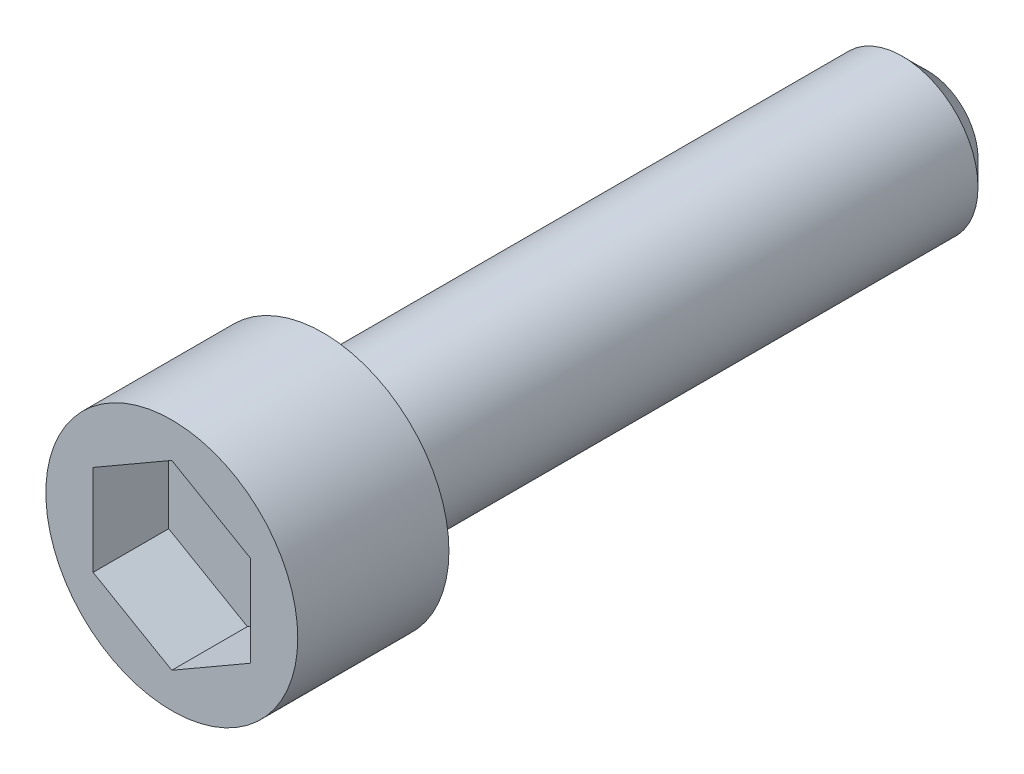
ISO-10303-21;
HEADER;
FILE_DESCRIPTION(('STEP AP214'),'2;1');
FILE_NAME('part.step','',(''),(''),'','','');
FILE_SCHEMA(('AUTOMOTIVE_DESIGN { 1 0 10303 214 1 1 1 1 }'));
ENDSEC;
DATA;
#1=APPLICATION_CONTEXT('core data for automotive mechanical design processes');
#2=APPLICATION_PROTOCOL_DEFINITION('international standard','automotive_design',2000,#1);
#3=PRODUCT_CONTEXT('',#1,'mechanical');
#4=PRODUCT('Part','Part','',(#3));
#5=PRODUCT_RELATED_PRODUCT_CATEGORY('part','',(#4));
#6=PRODUCT_DEFINITION_FORMATION('','',#4);
#7=PRODUCT_DEFINITION_CONTEXT('part definition',#1,'design');
#8=PRODUCT_DEFINITION('design','',#6,#7);
#9=PRODUCT_DEFINITION_SHAPE('','',#8);
#10=(LENGTH_UNIT() NAMED_UNIT(*) SI_UNIT(.MILLI.,.METRE.));
#11=(NAMED_UNIT(*) PLANE_ANGLE_UNIT() SI_UNIT($,.RADIAN.));
#12=(NAMED_UNIT(*) SI_UNIT($,.STERADIAN.) SOLID_ANGLE_UNIT());
#13=UNCERTAINTY_MEASURE_WITH_UNIT(LENGTH_MEASURE(1.E-05),#10,'distance_accuracy_value','');
#14=(GEOMETRIC_REPRESENTATION_CONTEXT(3) GLOBAL_UNCERTAINTY_ASSIGNED_CONTEXT((#13)) GLOBAL_UNIT_ASSIGNED_CONTEXT((#10,
#11,#12)) REPRESENTATION_CONTEXT('',''));
#15=CARTESIAN_POINT('',(0.,0.,0.));
#16=DIRECTION('',(0.,0.,1.));
#17=DIRECTION('',(1.,0.,0.));
#18=AXIS2_PLACEMENT_3D('',#15,#16,#17);
#19=CARTESIAN_POINT('',(0.,0.,12.));
#20=DIRECTION('',(0.,0.,-1.));
#21=DIRECTION('',(-1.,0.,0.));
#22=AXIS2_PLACEMENT_3D('',#19,#20,#21);
#23=CYLINDRICAL_SURFACE('',#22,1.5);
#24=CARTESIAN_POINT('',(0.,0.,0.499999999999999));
#25=DIRECTION('',(0.,0.,1.));
#26=DIRECTION('',(1.,0.,0.));
#27=AXIS2_PLACEMENT_3D('',#24,#25,#26);
#28=CIRCLE('',#27,1.5);
#29=CARTESIAN_POINT('',(1.5,0.,0.499999999999999));
#30=VERTEX_POINT('',#29);
#31=EDGE_CURVE('E44',#30,#30,#28,.T.);
#32=ORIENTED_EDGE('',*,*,#31,.T.);
#33=EDGE_LOOP('',(#32));
#34=FACE_BOUND('',#33,.T.);
#35=CARTESIAN_POINT('',(0.,0.,12.));
#36=DIRECTION('',(0.,0.,1.));
#37=DIRECTION('',(1.,0.,0.));
#38=AXIS2_PLACEMENT_3D('',#35,#36,#37);
#39=CIRCLE('',#38,1.5);
#40=CARTESIAN_POINT('',(1.5,0.,12.));
#41=VERTEX_POINT('',#40);
#42=EDGE_CURVE('E147',#41,#41,#39,.T.);
#43=ORIENTED_EDGE('',*,*,#42,.F.);
#44=EDGE_LOOP('',(#43));
#45=FACE_BOUND('',#44,.T.);
#46=ADVANCED_FACE('F36',(#34,#45),#23,.T.);
#47=CARTESIAN_POINT('',(0.,0.,0.));
#48=DIRECTION('',(0.,0.,1.));
#49=DIRECTION('',(1.,0.,0.));
#50=AXIS2_PLACEMENT_3D('',#47,#48,#49);
#51=PLANE('',#50);
#52=CARTESIAN_POINT('',(0.,0.,0.));
#53=DIRECTION('',(0.,0.,1.));
#54=DIRECTION('',(1.,0.,0.));
#55=AXIS2_PLACEMENT_3D('',#52,#53,#54);
#56=CIRCLE('',#55,0.999999999999999);
#57=CARTESIAN_POINT('',(0.999999999999999,0.,0.));
#58=VERTEX_POINT('',#57);
#59=EDGE_CURVE('E11',#58,#58,#56,.F.);
#60=ORIENTED_EDGE('',*,*,#59,.T.);
#61=EDGE_LOOP('',(#60));
#62=FACE_BOUND('',#61,.T.);
#63=ADVANCED_FACE('F165',(#62),#51,.F.);
#64=CARTESIAN_POINT('',(0.,0.,15.));
#65=DIRECTION('',(0.,0.,-1.));
#66=DIRECTION('',(-1.,0.,0.));
#67=AXIS2_PLACEMENT_3D('',#64,#65,#66);
#68=CYLINDRICAL_SURFACE('',#67,2.5);
#69=CARTESIAN_POINT('',(0.,0.,15.));
#70=DIRECTION('',(0.,0.,1.));
#71=DIRECTION('',(1.,0.,0.));
#72=AXIS2_PLACEMENT_3D('',#69,#70,#71);
#73=CIRCLE('',#72,2.5);
#74=CARTESIAN_POINT('',(2.5,0.,15.));
#75=VERTEX_POINT('',#74);
#76=EDGE_CURVE('E144',#75,#75,#73,.T.);
#77=ORIENTED_EDGE('',*,*,#76,.F.);
#78=EDGE_LOOP('',(#77));
#79=FACE_BOUND('',#78,.T.);
#80=CARTESIAN_POINT('',(0.,0.,12.));
#81=DIRECTION('',(0.,0.,1.));
#82=DIRECTION('',(1.,0.,0.));
#83=AXIS2_PLACEMENT_3D('',#80,#81,#82);
#84=CIRCLE('',#83,2.5);
#85=CARTESIAN_POINT('',(2.5,0.,12.));
#86=VERTEX_POINT('',#85);
#87=EDGE_CURVE('E138',#86,#86,#84,.T.);
#88=ORIENTED_EDGE('',*,*,#87,.T.);
#89=EDGE_LOOP('',(#88));
#90=FACE_BOUND('',#89,.T.);
#91=ADVANCED_FACE('F169',(#79,#90),#68,.T.);
#92=CARTESIAN_POINT('',(0.,0.,15.));
#93=DIRECTION('',(0.,0.,1.));
#94=DIRECTION('',(1.,0.,0.));
#95=AXIS2_PLACEMENT_3D('',#92,#93,#94);
#96=PLANE('',#95);
#97=DIRECTION('',(-0.866025403784442,0.499999999999995,0.));
#98=VECTOR('',#97,1.);
#99=CARTESIAN_POINT('',(1.56177486979958,0.901691141492407,15.));
#100=LINE('',#99,#98);
#101=CARTESIAN_POINT('',(1.56177486979958,0.901691141492407,15.));
#102=VERTEX_POINT('',#101);
#103=CARTESIAN_POINT('',(0.,1.80338228298478,15.));
#104=VERTEX_POINT('',#103);
#105=EDGE_CURVE('E51',#102,#104,#100,.T.);
#106=ORIENTED_EDGE('',*,*,#105,.F.);
#107=DIRECTION('',(0.,1.,0.));
#108=VECTOR('',#107,1.);
#109=CARTESIAN_POINT('',(1.5617748697996,-0.901691141492374,15.));
#110=LINE('',#109,#108);
#111=CARTESIAN_POINT('',(1.5617748697996,-0.901691141492374,15.));
#112=VERTEX_POINT('',#111);
#113=EDGE_CURVE('E134',#112,#102,#110,.T.);
#114=ORIENTED_EDGE('',*,*,#113,.F.);
#115=DIRECTION('',(0.866025403784435,0.500000000000007,0.));
#116=VECTOR('',#115,1.);
#117=CARTESIAN_POINT('',(0.,-1.80338228298478,15.));
#118=LINE('',#117,#116);
#119=CARTESIAN_POINT('',(0.,-1.80338228298478,15.));
#120=VERTEX_POINT('',#119);
#121=EDGE_CURVE('E132',#120,#112,#118,.T.);
#122=ORIENTED_EDGE('',*,*,#121,.F.);
#123=DIRECTION('',(0.866025403784441,-0.499999999999995,0.));
#124=VECTOR('',#123,1.);
#125=CARTESIAN_POINT('',(-1.56177486979959,-0.901691141492395,15.));
#126=LINE('',#125,#124);
#127=CARTESIAN_POINT('',(-1.56177486979959,-0.901691141492395,15.));
#128=VERTEX_POINT('',#127);
#129=EDGE_CURVE('E99',#128,#120,#126,.T.);
#130=ORIENTED_EDGE('',*,*,#129,.F.);
#131=DIRECTION('',(0.,-1.,0.));
#132=VECTOR('',#131,1.);
#133=CARTESIAN_POINT('',(-1.5617748697996,0.901691141492385,15.));
#134=LINE('',#133,#132);
#135=CARTESIAN_POINT('',(-1.5617748697996,0.901691141492385,15.));
#136=VERTEX_POINT('',#135);
#137=EDGE_CURVE('E128',#136,#128,#134,.T.);
#138=ORIENTED_EDGE('',*,*,#137,.F.);
#139=DIRECTION('',(-0.866025403784438,-0.500000000000001,0.));
#140=VECTOR('',#139,1.);
#141=CARTESIAN_POINT('',(0.,1.80338228298478,15.));
#142=LINE('',#141,#140);
#143=EDGE_CURVE('E125',#104,#136,#142,.T.);
#144=ORIENTED_EDGE('',*,*,#143,.F.);
#145=EDGE_LOOP('',(#106,#114,#122,#130,#138,#144));
#146=FACE_BOUND('',#145,.T.);
#147=ORIENTED_EDGE('',*,*,#76,.T.);
#148=EDGE_LOOP('',(#147));
#149=FACE_BOUND('',#148,.T.);
#150=ADVANCED_FACE('F175',(#146,#149),#96,.T.);
#151=CARTESIAN_POINT('',(0.,0.,12.));
#152=DIRECTION('',(0.,0.,1.));
#153=DIRECTION('',(1.,0.,0.));
#154=AXIS2_PLACEMENT_3D('',#151,#152,#153);
#155=PLANE('',#154);
#156=ORIENTED_EDGE('',*,*,#42,.T.);
#157=EDGE_LOOP('',(#156));
#158=FACE_BOUND('',#157,.T.);
#159=ORIENTED_EDGE('',*,*,#87,.F.);
#160=EDGE_LOOP('',(#159));
#161=FACE_BOUND('',#160,.T.);
#162=ADVANCED_FACE('F177',(#158,#161),#155,.F.);
#163=CARTESIAN_POINT('',(1.56177486979958,0.901691141492407,13.5));
#164=DIRECTION('',(0.499999999999995,0.866025403784441,0.));
#165=DIRECTION('',(-0.866025403784442,0.499999999999995,0.));
#166=AXIS2_PLACEMENT_3D('',#163,#164,#165);
#167=PLANE('',#166);
#168=ORIENTED_EDGE('',*,*,#105,.T.);
#169=DIRECTION('',(0.,0.,1.));
#170=VECTOR('',#169,1.);
#171=CARTESIAN_POINT('',(0.,1.80338228298478,13.5));
#172=LINE('',#171,#170);
#173=CARTESIAN_POINT('',(0.,1.80338228298478,13.5));
#174=VERTEX_POINT('',#173);
#175=EDGE_CURVE('E81',#174,#104,#172,.T.);
#176=ORIENTED_EDGE('',*,*,#175,.F.);
#177=DIRECTION('',(-0.866025403784442,0.499999999999995,0.));
#178=VECTOR('',#177,1.);
#179=CARTESIAN_POINT('',(1.56177486979958,0.901691141492407,13.5));
#180=LINE('',#179,#178);
#181=CARTESIAN_POINT('',(1.56177486979958,0.901691141492407,13.5));
#182=VERTEX_POINT('',#181);
#183=EDGE_CURVE('E136',#182,#174,#180,.T.);
#184=ORIENTED_EDGE('',*,*,#183,.F.);
#185=DIRECTION('',(0.,0.,1.));
#186=VECTOR('',#185,1.);
#187=CARTESIAN_POINT('',(1.56177486979958,0.901691141492407,13.5));
#188=LINE('',#187,#186);
#189=EDGE_CURVE('E59',#182,#102,#188,.T.);
#190=ORIENTED_EDGE('',*,*,#189,.T.);
#191=EDGE_LOOP('',(#168,#176,#184,#190));
#192=FACE_BOUND('',#191,.T.);
#193=ADVANCED_FACE('F180',(#192),#167,.F.);
#194=CARTESIAN_POINT('',(1.5617748697996,-0.901691141492374,13.5));
#195=DIRECTION('',(1.,0.,0.));
#196=DIRECTION('',(0.,1.,0.));
#197=AXIS2_PLACEMENT_3D('',#194,#195,#196);
#198=PLANE('',#197);
#199=ORIENTED_EDGE('',*,*,#113,.T.);
#200=ORIENTED_EDGE('',*,*,#189,.F.);
#201=DIRECTION('',(0.,1.,0.));
#202=VECTOR('',#201,1.);
#203=CARTESIAN_POINT('',(1.5617748697996,-0.901691141492374,13.5));
#204=LINE('',#203,#202);
#205=CARTESIAN_POINT('',(1.5617748697996,-0.901691141492374,13.5));
#206=VERTEX_POINT('',#205);
#207=EDGE_CURVE('E111',#206,#182,#204,.T.);
#208=ORIENTED_EDGE('',*,*,#207,.F.);
#209=DIRECTION('',(0.,0.,1.));
#210=VECTOR('',#209,1.);
#211=CARTESIAN_POINT('',(1.5617748697996,-0.901691141492374,13.5));
#212=LINE('',#211,#210);
#213=EDGE_CURVE('E103',#206,#112,#212,.T.);
#214=ORIENTED_EDGE('',*,*,#213,.T.);
#215=EDGE_LOOP('',(#199,#200,#208,#214));
#216=FACE_BOUND('',#215,.T.);
#217=ADVANCED_FACE('F187',(#216),#198,.F.);
#218=CARTESIAN_POINT('',(0.,-1.80338228298478,13.5));
#219=DIRECTION('',(0.500000000000007,-0.866025403784435,0.));
#220=DIRECTION('',(0.866025403784434,0.500000000000007,0.));
#221=AXIS2_PLACEMENT_3D('',#218,#219,#220);
#222=PLANE('',#221);
#223=ORIENTED_EDGE('',*,*,#121,.T.);
#224=ORIENTED_EDGE('',*,*,#213,.F.);
#225=DIRECTION('',(0.866025403784435,0.500000000000007,0.));
#226=VECTOR('',#225,1.);
#227=CARTESIAN_POINT('',(0.,-1.80338228298478,13.5));
#228=LINE('',#227,#226);
#229=CARTESIAN_POINT('',(0.,-1.80338228298478,13.5));
#230=VERTEX_POINT('',#229);
#231=EDGE_CURVE('E107',#230,#206,#228,.T.);
#232=ORIENTED_EDGE('',*,*,#231,.F.);
#233=DIRECTION('',(0.,0.,1.));
#234=VECTOR('',#233,1.);
#235=CARTESIAN_POINT('',(0.,-1.80338228298478,13.5));
#236=LINE('',#235,#234);
#237=EDGE_CURVE('E92',#230,#120,#236,.T.);
#238=ORIENTED_EDGE('',*,*,#237,.T.);
#239=EDGE_LOOP('',(#223,#224,#232,#238));
#240=FACE_BOUND('',#239,.T.);
#241=ADVANCED_FACE('F108',(#240),#222,.F.);
#242=CARTESIAN_POINT('',(-1.56177486979959,-0.901691141492395,13.5));
#243=DIRECTION('',(-0.499999999999995,-0.866025403784441,0.));
#244=DIRECTION('',(0.866025403784442,-0.499999999999995,0.));
#245=AXIS2_PLACEMENT_3D('',#242,#243,#244);
#246=PLANE('',#245);
#247=ORIENTED_EDGE('',*,*,#129,.T.);
#248=ORIENTED_EDGE('',*,*,#237,.F.);
#249=DIRECTION('',(0.866025403784441,-0.499999999999995,0.));
#250=VECTOR('',#249,1.);
#251=CARTESIAN_POINT('',(-1.56177486979959,-0.901691141492395,13.5));
#252=LINE('',#251,#250);
#253=CARTESIAN_POINT('',(-1.56177486979959,-0.901691141492395,13.5));
#254=VERTEX_POINT('',#253);
#255=EDGE_CURVE('E96',#254,#230,#252,.T.);
#256=ORIENTED_EDGE('',*,*,#255,.F.);
#257=DIRECTION('',(0.,0.,1.));
#258=VECTOR('',#257,1.);
#259=CARTESIAN_POINT('',(-1.56177486979959,-0.901691141492395,13.5));
#260=LINE('',#259,#258);
#261=EDGE_CURVE('E104',#254,#128,#260,.T.);
#262=ORIENTED_EDGE('',*,*,#261,.T.);
#263=EDGE_LOOP('',(#247,#248,#256,#262));
#264=FACE_BOUND('',#263,.T.);
#265=ADVANCED_FACE('F94',(#264),#246,.F.);
#266=CARTESIAN_POINT('',(-1.5617748697996,0.901691141492385,13.5));
#267=DIRECTION('',(-1.,0.,0.));
#268=DIRECTION('',(0.,-1.,0.));
#269=AXIS2_PLACEMENT_3D('',#266,#267,#268);
#270=PLANE('',#269);
#271=ORIENTED_EDGE('',*,*,#137,.T.);
#272=ORIENTED_EDGE('',*,*,#261,.F.);
#273=DIRECTION('',(0.,-1.,0.));
#274=VECTOR('',#273,1.);
#275=CARTESIAN_POINT('',(-1.5617748697996,0.901691141492385,13.5));
#276=LINE('',#275,#274);
#277=CARTESIAN_POINT('',(-1.5617748697996,0.901691141492385,13.5));
#278=VERTEX_POINT('',#277);
#279=EDGE_CURVE('E117',#278,#254,#276,.T.);
#280=ORIENTED_EDGE('',*,*,#279,.F.);
#281=DIRECTION('',(0.,0.,1.));
#282=VECTOR('',#281,1.);
#283=CARTESIAN_POINT('',(-1.5617748697996,0.901691141492385,13.5));
#284=LINE('',#283,#282);
#285=EDGE_CURVE('E141',#278,#136,#284,.T.);
#286=ORIENTED_EDGE('',*,*,#285,.T.);
#287=EDGE_LOOP('',(#271,#272,#280,#286));
#288=FACE_BOUND('',#287,.T.);
#289=ADVANCED_FACE('F190',(#288),#270,.F.);
#290=CARTESIAN_POINT('',(0.,1.80338228298478,13.5));
#291=DIRECTION('',(-0.500000000000001,0.866025403784438,0.));
#292=DIRECTION('',(-0.866025403784438,-0.500000000000001,0.));
#293=AXIS2_PLACEMENT_3D('',#290,#291,#292);
#294=PLANE('',#293);
#295=ORIENTED_EDGE('',*,*,#143,.T.);
#296=ORIENTED_EDGE('',*,*,#285,.F.);
#297=DIRECTION('',(-0.866025403784438,-0.500000000000001,0.));
#298=VECTOR('',#297,1.);
#299=CARTESIAN_POINT('',(0.,1.80338228298478,13.5));
#300=LINE('',#299,#298);
#301=EDGE_CURVE('E119',#174,#278,#300,.T.);
#302=ORIENTED_EDGE('',*,*,#301,.F.);
#303=ORIENTED_EDGE('',*,*,#175,.T.);
#304=EDGE_LOOP('',(#295,#296,#302,#303));
#305=FACE_BOUND('',#304,.T.);
#306=ADVANCED_FACE('F161',(#305),#294,.F.);
#307=CARTESIAN_POINT('',(0.,0.,13.5));
#308=DIRECTION('',(0.,0.,1.));
#309=DIRECTION('',(1.,0.,0.));
#310=AXIS2_PLACEMENT_3D('',#307,#308,#309);
#311=PLANE('',#310);
#312=ORIENTED_EDGE('',*,*,#183,.T.);
#313=ORIENTED_EDGE('',*,*,#301,.T.);
#314=ORIENTED_EDGE('',*,*,#279,.T.);
#315=ORIENTED_EDGE('',*,*,#255,.T.);
#316=ORIENTED_EDGE('',*,*,#231,.T.);
#317=ORIENTED_EDGE('',*,*,#207,.T.);
#318=EDGE_LOOP('',(#312,#313,#314,#315,#316,#317));
#319=FACE_BOUND('',#318,.T.);
#320=ADVANCED_FACE('F114',(#319),#311,.T.);
#321=CARTESIAN_POINT('',(0.,0.,0.499999999999999));
#322=DIRECTION('',(0.,0.,1.));
#323=DIRECTION('',(1.,0.,0.));
#324=AXIS2_PLACEMENT_3D('',#321,#322,#323);
#325=CONICAL_SURFACE('',#324,1.5,0.785398163397452);
#326=ORIENTED_EDGE('',*,*,#59,.F.);
#327=EDGE_LOOP('',(#326));
#328=FACE_BOUND('',#327,.T.);
#329=ORIENTED_EDGE('',*,*,#31,.F.);
#330=EDGE_LOOP('',(#329));
#331=FACE_BOUND('',#330,.T.);
#332=ADVANCED_FACE('F38',(#328,#331),#325,.T.);
#333=CLOSED_SHELL('',(#46,#63,#91,#150,#162,#193,#217,#241,#265,#289,#306,#320,#332));
#334=MANIFOLD_SOLID_BREP('B2',#333);
#335=ADVANCED_BREP_SHAPE_REPRESENTATION('',(#18,#334),#14);
#336=SHAPE_DEFINITION_REPRESENTATION(#9,#335);
ENDSEC;
END-ISO-10303-21;
